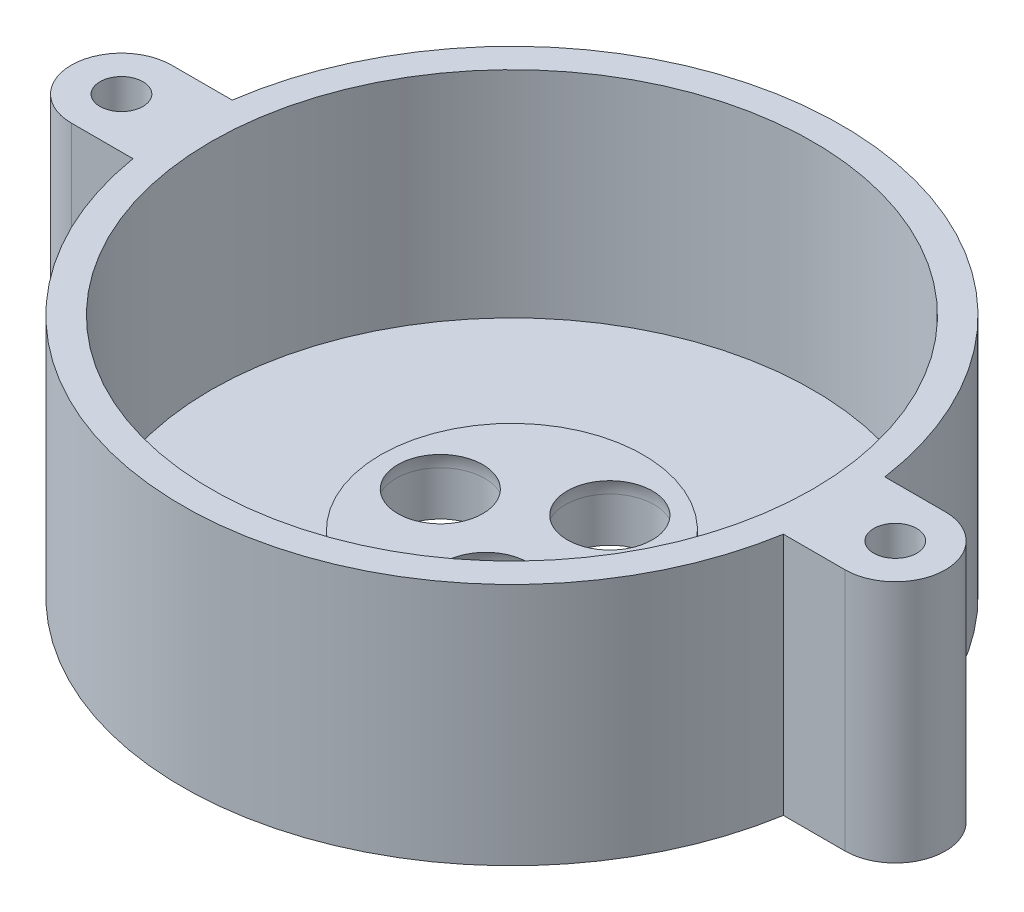
ISO-10303-21;
HEADER;
FILE_DESCRIPTION(('STEP AP214'),'2;1');
FILE_NAME('part.step','',(''),(''),'','','');
FILE_SCHEMA(('AUTOMOTIVE_DESIGN { 1 0 10303 214 1 1 1 1 }'));
ENDSEC;
DATA;
#1=APPLICATION_CONTEXT('core data for automotive mechanical design processes');
#2=APPLICATION_PROTOCOL_DEFINITION('international standard','automotive_design',2000,#1);
#3=PRODUCT_CONTEXT('',#1,'mechanical');
#4=PRODUCT('Part','Part','',(#3));
#5=PRODUCT_RELATED_PRODUCT_CATEGORY('part','',(#4));
#6=PRODUCT_DEFINITION_FORMATION('','',#4);
#7=PRODUCT_DEFINITION_CONTEXT('part definition',#1,'design');
#8=PRODUCT_DEFINITION('design','',#6,#7);
#9=PRODUCT_DEFINITION_SHAPE('','',#8);
#10=(LENGTH_UNIT() NAMED_UNIT(*) SI_UNIT(.MILLI.,.METRE.));
#11=(NAMED_UNIT(*) PLANE_ANGLE_UNIT() SI_UNIT($,.RADIAN.));
#12=(NAMED_UNIT(*) SI_UNIT($,.STERADIAN.) SOLID_ANGLE_UNIT());
#13=UNCERTAINTY_MEASURE_WITH_UNIT(LENGTH_MEASURE(1.E-05),#10,'distance_accuracy_value','');
#14=(GEOMETRIC_REPRESENTATION_CONTEXT(3) GLOBAL_UNCERTAINTY_ASSIGNED_CONTEXT((#13)) GLOBAL_UNIT_ASSIGNED_CONTEXT((#10,
#11,#12)) REPRESENTATION_CONTEXT('',''));
#15=CARTESIAN_POINT('',(0.,0.,0.));
#16=DIRECTION('',(0.,0.,1.));
#17=DIRECTION('',(1.,0.,0.));
#18=AXIS2_PLACEMENT_3D('',#15,#16,#17);
#19=CARTESIAN_POINT('',(0.,17.,0.));
#20=DIRECTION('',(0.,-1.,0.));
#21=DIRECTION('',(1.,0.,0.));
#22=AXIS2_PLACEMENT_3D('',#19,#20,#21);
#23=PLANE('',#22);
#24=CARTESIAN_POINT('',(0.,17.,0.));
#25=DIRECTION('',(0.,-1.,0.));
#26=DIRECTION('',(1.,0.,0.));
#27=AXIS2_PLACEMENT_3D('',#24,#25,#26);
#28=CIRCLE('',#27,21.);
#29=CARTESIAN_POINT('',(21.,17.,0.));
#30=VERTEX_POINT('',#29);
#31=EDGE_CURVE('E40',#30,#30,#28,.T.);
#32=ORIENTED_EDGE('',*,*,#31,.T.);
#33=EDGE_LOOP('',(#32));
#34=FACE_BOUND('',#33,.T.);
#35=CARTESIAN_POINT('',(27.,17.,0.250000000000004));
#36=DIRECTION('',(0.,-1.,0.));
#37=DIRECTION('',(1.,0.,0.));
#38=AXIS2_PLACEMENT_3D('',#35,#36,#37);
#39=CIRCLE('',#38,1.5);
#40=CARTESIAN_POINT('',(28.5,17.,0.250000000000004));
#41=VERTEX_POINT('',#40);
#42=EDGE_CURVE('E166',#41,#41,#39,.F.);
#43=ORIENTED_EDGE('',*,*,#42,.F.);
#44=EDGE_LOOP('',(#43));
#45=FACE_BOUND('',#44,.T.);
#46=DIRECTION('',(-1.,0.,0.));
#47=VECTOR('',#46,1.);
#48=CARTESIAN_POINT('',(-27.,17.,-3.25));
#49=LINE('',#48,#47);
#50=CARTESIAN_POINT('',(-22.7692226481274,17.,-3.24999999999999));
#51=VERTEX_POINT('',#50);
#52=CARTESIAN_POINT('',(-27.,17.,-3.25));
#53=VERTEX_POINT('',#52);
#54=EDGE_CURVE('E184',#51,#53,#49,.T.);
#55=ORIENTED_EDGE('',*,*,#54,.T.);
#56=CARTESIAN_POINT('',(-27.,17.,0.250000000000004));
#57=DIRECTION('',(0.,-1.,0.));
#58=DIRECTION('',(1.,0.,0.));
#59=AXIS2_PLACEMENT_3D('',#56,#57,#58);
#60=CIRCLE('',#59,3.5);
#61=CARTESIAN_POINT('',(-27.,17.,3.75));
#62=VERTEX_POINT('',#61);
#63=EDGE_CURVE('E193',#53,#62,#60,.F.);
#64=ORIENTED_EDGE('',*,*,#63,.T.);
#65=DIRECTION('',(1.,0.,0.));
#66=VECTOR('',#65,1.);
#67=CARTESIAN_POINT('',(-27.,17.,3.75));
#68=LINE('',#67,#66);
#69=CARTESIAN_POINT('',(-22.6922343545099,17.,3.75));
#70=VERTEX_POINT('',#69);
#71=EDGE_CURVE('E190',#62,#70,#68,.T.);
#72=ORIENTED_EDGE('',*,*,#71,.T.);
#73=CARTESIAN_POINT('',(0.,17.,0.));
#74=DIRECTION('',(0.,-1.,0.));
#75=DIRECTION('',(1.,0.,0.));
#76=AXIS2_PLACEMENT_3D('',#73,#74,#75);
#77=CIRCLE('',#76,23.);
#78=CARTESIAN_POINT('',(22.6922343545099,17.,3.75));
#79=VERTEX_POINT('',#78);
#80=EDGE_CURVE('E185',#79,#70,#77,.T.);
#81=ORIENTED_EDGE('',*,*,#80,.F.);
#82=DIRECTION('',(1.,0.,0.));
#83=VECTOR('',#82,1.);
#84=CARTESIAN_POINT('',(27.,17.,3.75));
#85=LINE('',#84,#83);
#86=CARTESIAN_POINT('',(27.,17.,3.75));
#87=VERTEX_POINT('',#86);
#88=EDGE_CURVE('E11',#79,#87,#85,.T.);
#89=ORIENTED_EDGE('',*,*,#88,.T.);
#90=CARTESIAN_POINT('',(27.,17.,0.250000000000004));
#91=DIRECTION('',(0.,-1.,0.));
#92=DIRECTION('',(1.,0.,0.));
#93=AXIS2_PLACEMENT_3D('',#90,#91,#92);
#94=CIRCLE('',#93,3.5);
#95=CARTESIAN_POINT('',(27.,17.,-3.25));
#96=VERTEX_POINT('',#95);
#97=EDGE_CURVE('E53',#87,#96,#94,.F.);
#98=ORIENTED_EDGE('',*,*,#97,.T.);
#99=DIRECTION('',(-1.,0.,0.));
#100=VECTOR('',#99,1.);
#101=CARTESIAN_POINT('',(27.,17.,-3.25));
#102=LINE('',#101,#100);
#103=CARTESIAN_POINT('',(22.7692226481274,17.,-3.25));
#104=VERTEX_POINT('',#103);
#105=EDGE_CURVE('E45',#96,#104,#102,.T.);
#106=ORIENTED_EDGE('',*,*,#105,.T.);
#107=EDGE_CURVE('E187',#51,#104,#77,.T.);
#108=ORIENTED_EDGE('',*,*,#107,.F.);
#109=EDGE_LOOP('',(#55,#64,#72,#81,#89,#98,#106,#108));
#110=FACE_BOUND('',#109,.T.);
#111=CARTESIAN_POINT('',(-27.,17.,0.250000000000004));
#112=DIRECTION('',(0.,-1.,0.));
#113=DIRECTION('',(1.,0.,0.));
#114=AXIS2_PLACEMENT_3D('',#111,#112,#113);
#115=CIRCLE('',#114,1.5);
#116=CARTESIAN_POINT('',(-25.5,17.,0.250000000000004));
#117=VERTEX_POINT('',#116);
#118=EDGE_CURVE('E181',#117,#117,#115,.F.);
#119=ORIENTED_EDGE('',*,*,#118,.F.);
#120=EDGE_LOOP('',(#119));
#121=FACE_BOUND('',#120,.T.);
#122=ADVANCED_FACE('F37',(#34,#45,#110,#121),#23,.F.);
#123=CARTESIAN_POINT('',(0.,4.,0.));
#124=DIRECTION('',(0.,-1.,0.));
#125=DIRECTION('',(1.,0.,0.));
#126=AXIS2_PLACEMENT_3D('',#123,#124,#125);
#127=PLANE('',#126);
#128=CARTESIAN_POINT('',(2.49999999999996,4.,4.33012701892222));
#129=DIRECTION('',(0.,-1.,0.));
#130=DIRECTION('',(1.,0.,0.));
#131=AXIS2_PLACEMENT_3D('',#128,#129,#130);
#132=CIRCLE('',#131,2.96647939483827);
#133=CARTESIAN_POINT('',(5.46647939483823,4.,4.33012701892222));
#134=VERTEX_POINT('',#133);
#135=EDGE_CURVE('E175',#134,#134,#132,.F.);
#136=ORIENTED_EDGE('',*,*,#135,.F.);
#137=EDGE_LOOP('',(#136));
#138=FACE_BOUND('',#137,.T.);
#139=CARTESIAN_POINT('',(2.50000000000002,4.,-4.33012701892218));
#140=DIRECTION('',(0.,-1.,0.));
#141=DIRECTION('',(1.,0.,0.));
#142=AXIS2_PLACEMENT_3D('',#139,#140,#141);
#143=CIRCLE('',#142,2.96647939483827);
#144=CARTESIAN_POINT('',(5.46647939483829,4.,-4.33012701892218));
#145=VERTEX_POINT('',#144);
#146=EDGE_CURVE('E170',#145,#145,#143,.F.);
#147=ORIENTED_EDGE('',*,*,#146,.F.);
#148=EDGE_LOOP('',(#147));
#149=FACE_BOUND('',#148,.T.);
#150=CARTESIAN_POINT('',(-5.,4.,0.));
#151=DIRECTION('',(0.,-1.,0.));
#152=DIRECTION('',(1.,0.,0.));
#153=AXIS2_PLACEMENT_3D('',#150,#151,#152);
#154=CIRCLE('',#153,2.96647939483827);
#155=CARTESIAN_POINT('',(-2.03352060516173,4.,0.));
#156=VERTEX_POINT('',#155);
#157=EDGE_CURVE('E124',#156,#156,#154,.F.);
#158=ORIENTED_EDGE('',*,*,#157,.F.);
#159=EDGE_LOOP('',(#158));
#160=FACE_BOUND('',#159,.T.);
#161=CARTESIAN_POINT('',(0.,4.,0.));
#162=DIRECTION('',(0.,1.,0.));
#163=DIRECTION('',(-1.,0.,0.));
#164=AXIS2_PLACEMENT_3D('',#161,#162,#163);
#165=CIRCLE('',#164,9.15767728552784);
#166=CARTESIAN_POINT('',(-9.15767728552784,4.,0.));
#167=VERTEX_POINT('',#166);
#168=EDGE_CURVE('E160',#167,#167,#165,.T.);
#169=ORIENTED_EDGE('',*,*,#168,.T.);
#170=EDGE_LOOP('',(#169));
#171=FACE_BOUND('',#170,.T.);
#172=ADVANCED_FACE('F223',(#138,#149,#160,#171),#127,.F.);
#173=CARTESIAN_POINT('',(0.,25.4499443206436,0.));
#174=DIRECTION('',(0.,1.,0.));
#175=DIRECTION('',(-1.,0.,0.));
#176=AXIS2_PLACEMENT_3D('',#173,#174,#175);
#177=CYLINDRICAL_SURFACE('',#176,9.15767728552784);
#178=CARTESIAN_POINT('',(0.,2.,0.));
#179=DIRECTION('',(0.,1.,0.));
#180=DIRECTION('',(-1.,0.,0.));
#181=AXIS2_PLACEMENT_3D('',#178,#179,#180);
#182=CIRCLE('',#181,9.15767728552784);
#183=CARTESIAN_POINT('',(-9.15767728552784,2.,0.));
#184=VERTEX_POINT('',#183);
#185=EDGE_CURVE('E157',#184,#184,#182,.T.);
#186=ORIENTED_EDGE('',*,*,#185,.T.);
#187=EDGE_LOOP('',(#186));
#188=FACE_BOUND('',#187,.T.);
#189=ORIENTED_EDGE('',*,*,#168,.F.);
#190=EDGE_LOOP('',(#189));
#191=FACE_BOUND('',#190,.T.);
#192=ADVANCED_FACE('F229',(#188,#191),#177,.T.);
#193=CARTESIAN_POINT('',(0.,2.,0.));
#194=DIRECTION('',(0.,1.,0.));
#195=DIRECTION('',(-1.,0.,0.));
#196=AXIS2_PLACEMENT_3D('',#193,#194,#195);
#197=PLANE('',#196);
#198=CARTESIAN_POINT('',(0.,2.,0.));
#199=DIRECTION('',(0.,1.,0.));
#200=DIRECTION('',(-1.,0.,0.));
#201=AXIS2_PLACEMENT_3D('',#198,#199,#200);
#202=CIRCLE('',#201,21.);
#203=CARTESIAN_POINT('',(-21.,2.,0.));
#204=VERTEX_POINT('',#203);
#205=EDGE_CURVE('E149',#204,#204,#202,.T.);
#206=ORIENTED_EDGE('',*,*,#205,.T.);
#207=EDGE_LOOP('',(#206));
#208=FACE_BOUND('',#207,.T.);
#209=ORIENTED_EDGE('',*,*,#185,.F.);
#210=EDGE_LOOP('',(#209));
#211=FACE_BOUND('',#210,.T.);
#212=ADVANCED_FACE('F253',(#208,#211),#197,.T.);
#213=CARTESIAN_POINT('',(0.,25.4499443206436,0.));
#214=DIRECTION('',(0.,1.,0.));
#215=DIRECTION('',(-1.,0.,0.));
#216=AXIS2_PLACEMENT_3D('',#213,#214,#215);
#217=CYLINDRICAL_SURFACE('',#216,21.);
#218=ORIENTED_EDGE('',*,*,#31,.F.);
#219=EDGE_LOOP('',(#218));
#220=FACE_BOUND('',#219,.T.);
#221=ORIENTED_EDGE('',*,*,#205,.F.);
#222=EDGE_LOOP('',(#221));
#223=FACE_BOUND('',#222,.T.);
#224=ADVANCED_FACE('F249',(#220,#223),#217,.F.);
#225=CARTESIAN_POINT('',(-5.,3.1,0.));
#226=DIRECTION('',(0.,1.,0.));
#227=DIRECTION('',(-1.,0.,0.));
#228=AXIS2_PLACEMENT_3D('',#225,#226,#227);
#229=SPHERICAL_SURFACE('',#228,3.1);
#230=CARTESIAN_POINT('',(-5.,3.1,0.));
#231=DIRECTION('',(0.,1.,0.));
#232=DIRECTION('',(0.,0.,1.));
#233=AXIS2_PLACEMENT_3D('',#230,#231,#232);
#234=CIRCLE('',#233,3.1);
#235=CARTESIAN_POINT('',(-5.,3.1,3.1));
#236=VERTEX_POINT('',#235);
#237=EDGE_CURVE('E173',#236,#236,#234,.T.);
#238=ORIENTED_EDGE('',*,*,#237,.F.);
#239=EDGE_LOOP('',(#238));
#240=FACE_BOUND('',#239,.T.);
#241=ORIENTED_EDGE('',*,*,#157,.T.);
#242=EDGE_LOOP('',(#241));
#243=FACE_BOUND('',#242,.T.);
#244=ADVANCED_FACE('F252',(#240,#243),#229,.F.);
#245=CARTESIAN_POINT('',(2.50000000000002,3.1,-4.33012701892218));
#246=DIRECTION('',(0.,1.,0.));
#247=DIRECTION('',(0.500000000000004,0.,-0.866025403784436));
#248=AXIS2_PLACEMENT_3D('',#245,#246,#247);
#249=SPHERICAL_SURFACE('',#248,3.1);
#250=CARTESIAN_POINT('',(2.50000000000002,3.1,-4.33012701892218));
#251=DIRECTION('',(0.,1.,0.));
#252=DIRECTION('',(-0.866025403784436,0.,-0.500000000000004));
#253=AXIS2_PLACEMENT_3D('',#250,#251,#252);
#254=CIRCLE('',#253,3.1);
#255=CARTESIAN_POINT('',(-0.184678751731733,3.1,-5.8801270189222));
#256=VERTEX_POINT('',#255);
#257=EDGE_CURVE('E178',#256,#256,#254,.T.);
#258=ORIENTED_EDGE('',*,*,#257,.F.);
#259=EDGE_LOOP('',(#258));
#260=FACE_BOUND('',#259,.T.);
#261=ORIENTED_EDGE('',*,*,#146,.T.);
#262=EDGE_LOOP('',(#261));
#263=FACE_BOUND('',#262,.T.);
#264=ADVANCED_FACE('F286',(#260,#263),#249,.F.);
#265=CARTESIAN_POINT('',(2.49999999999996,3.1,4.33012701892222));
#266=DIRECTION('',(0.,1.,0.));
#267=DIRECTION('',(0.499999999999992,0.,0.866025403784443));
#268=AXIS2_PLACEMENT_3D('',#265,#266,#267);
#269=SPHERICAL_SURFACE('',#268,3.1);
#270=CARTESIAN_POINT('',(2.49999999999996,3.1,4.33012701892222));
#271=DIRECTION('',(0.,1.,0.));
#272=DIRECTION('',(0.866025403784443,0.,-0.499999999999992));
#273=AXIS2_PLACEMENT_3D('',#270,#271,#272);
#274=CIRCLE('',#273,3.1);
#275=CARTESIAN_POINT('',(5.18467875173173,3.1,2.78012701892224));
#276=VERTEX_POINT('',#275);
#277=EDGE_CURVE('E310',#276,#276,#274,.T.);
#278=ORIENTED_EDGE('',*,*,#277,.F.);
#279=EDGE_LOOP('',(#278));
#280=FACE_BOUND('',#279,.T.);
#281=ORIENTED_EDGE('',*,*,#135,.T.);
#282=EDGE_LOOP('',(#281));
#283=FACE_BOUND('',#282,.T.);
#284=ADVANCED_FACE('F292',(#280,#283),#269,.F.);
#285=CARTESIAN_POINT('',(-5.,6.2,0.));
#286=DIRECTION('',(0.,1.,0.));
#287=DIRECTION('',(0.,0.,1.));
#288=AXIS2_PLACEMENT_3D('',#285,#286,#287);
#289=CYLINDRICAL_SURFACE('',#288,3.1);
#290=ORIENTED_EDGE('',*,*,#237,.T.);
#291=EDGE_LOOP('',(#290));
#292=FACE_BOUND('',#291,.T.);
#293=CARTESIAN_POINT('',(-5.,0.,0.));
#294=DIRECTION('',(0.,1.,0.));
#295=DIRECTION('',(0.,0.,1.));
#296=AXIS2_PLACEMENT_3D('',#293,#294,#295);
#297=CIRCLE('',#296,3.1);
#298=CARTESIAN_POINT('',(-5.,0.,3.1));
#299=VERTEX_POINT('',#298);
#300=EDGE_CURVE('E169',#299,#299,#297,.T.);
#301=ORIENTED_EDGE('',*,*,#300,.F.);
#302=EDGE_LOOP('',(#301));
#303=FACE_BOUND('',#302,.T.);
#304=ADVANCED_FACE('F288',(#292,#303),#289,.F.);
#305=CARTESIAN_POINT('',(2.50000000000002,6.2,-4.33012701892218));
#306=DIRECTION('',(0.,1.,0.));
#307=DIRECTION('',(-0.866025403784436,0.,-0.500000000000004));
#308=AXIS2_PLACEMENT_3D('',#305,#306,#307);
#309=CYLINDRICAL_SURFACE('',#308,3.1);
#310=ORIENTED_EDGE('',*,*,#257,.T.);
#311=EDGE_LOOP('',(#310));
#312=FACE_BOUND('',#311,.T.);
#313=CARTESIAN_POINT('',(2.50000000000002,0.,-4.33012701892218));
#314=DIRECTION('',(0.,1.,0.));
#315=DIRECTION('',(-0.866025403784436,0.,-0.500000000000004));
#316=AXIS2_PLACEMENT_3D('',#313,#314,#315);
#317=CIRCLE('',#316,3.1);
#318=CARTESIAN_POINT('',(-0.184678751731733,0.,-5.8801270189222));
#319=VERTEX_POINT('',#318);
#320=EDGE_CURVE('E174',#319,#319,#317,.T.);
#321=ORIENTED_EDGE('',*,*,#320,.F.);
#322=EDGE_LOOP('',(#321));
#323=FACE_BOUND('',#322,.T.);
#324=ADVANCED_FACE('F291',(#312,#323),#309,.F.);
#325=CARTESIAN_POINT('',(2.49999999999996,6.2,4.33012701892222));
#326=DIRECTION('',(0.,1.,0.));
#327=DIRECTION('',(0.866025403784443,0.,-0.499999999999992));
#328=AXIS2_PLACEMENT_3D('',#325,#326,#327);
#329=CYLINDRICAL_SURFACE('',#328,3.1);
#330=ORIENTED_EDGE('',*,*,#277,.T.);
#331=EDGE_LOOP('',(#330));
#332=FACE_BOUND('',#331,.T.);
#333=CARTESIAN_POINT('',(2.49999999999996,0.,4.33012701892222));
#334=DIRECTION('',(0.,1.,0.));
#335=DIRECTION('',(0.866025403784443,0.,-0.499999999999992));
#336=AXIS2_PLACEMENT_3D('',#333,#334,#335);
#337=CIRCLE('',#336,3.1);
#338=CARTESIAN_POINT('',(5.18467875173173,0.,2.78012701892224));
#339=VERTEX_POINT('',#338);
#340=EDGE_CURVE('E179',#339,#339,#337,.T.);
#341=ORIENTED_EDGE('',*,*,#340,.F.);
#342=EDGE_LOOP('',(#341));
#343=FACE_BOUND('',#342,.T.);
#344=ADVANCED_FACE('F247',(#332,#343),#329,.F.);
#345=CARTESIAN_POINT('',(-27.,20.,0.250000000000004));
#346=DIRECTION('',(0.,-1.,0.));
#347=DIRECTION('',(0.,0.,-1.));
#348=AXIS2_PLACEMENT_3D('',#345,#346,#347);
#349=CYLINDRICAL_SURFACE('',#348,3.5);
#350=ORIENTED_EDGE('',*,*,#63,.F.);
#351=DIRECTION('',(0.,-1.,0.));
#352=VECTOR('',#351,1.);
#353=CARTESIAN_POINT('',(-27.,20.,-3.25));
#354=LINE('',#353,#352);
#355=CARTESIAN_POINT('',(-27.,0.,-3.25));
#356=VERTEX_POINT('',#355);
#357=EDGE_CURVE('E146',#53,#356,#354,.T.);
#358=ORIENTED_EDGE('',*,*,#357,.T.);
#359=CARTESIAN_POINT('',(-27.,0.,0.250000000000004));
#360=DIRECTION('',(0.,-1.,0.));
#361=DIRECTION('',(0.,0.,-1.));
#362=AXIS2_PLACEMENT_3D('',#359,#360,#361);
#363=CIRCLE('',#362,3.5);
#364=CARTESIAN_POINT('',(-27.,0.,3.75));
#365=VERTEX_POINT('',#364);
#366=EDGE_CURVE('E137',#365,#356,#363,.T.);
#367=ORIENTED_EDGE('',*,*,#366,.F.);
#368=DIRECTION('',(0.,-1.,0.));
#369=VECTOR('',#368,1.);
#370=CARTESIAN_POINT('',(-27.,20.,3.75));
#371=LINE('',#370,#369);
#372=EDGE_CURVE('E147',#62,#365,#371,.T.);
#373=ORIENTED_EDGE('',*,*,#372,.F.);
#374=EDGE_LOOP('',(#350,#358,#367,#373));
#375=FACE_BOUND('',#374,.T.);
#376=ADVANCED_FACE('F244',(#375),#349,.T.);
#377=CARTESIAN_POINT('',(0.,25.4499443206436,0.));
#378=DIRECTION('',(0.,1.,0.));
#379=DIRECTION('',(-1.,0.,0.));
#380=AXIS2_PLACEMENT_3D('',#377,#378,#379);
#381=CYLINDRICAL_SURFACE('',#380,23.);
#382=DIRECTION('',(0.,-1.,0.));
#383=VECTOR('',#382,1.);
#384=CARTESIAN_POINT('',(-22.7692226481274,20.,-3.24999999999999));
#385=LINE('',#384,#383);
#386=CARTESIAN_POINT('',(-22.7692226481274,0.,-3.25));
#387=VERTEX_POINT('',#386);
#388=EDGE_CURVE('E152',#51,#387,#385,.T.);
#389=ORIENTED_EDGE('',*,*,#388,.F.);
#390=ORIENTED_EDGE('',*,*,#107,.T.);
#391=DIRECTION('',(0.,-1.,0.));
#392=VECTOR('',#391,1.);
#393=CARTESIAN_POINT('',(22.7692226481274,20.,-3.25));
#394=LINE('',#393,#392);
#395=CARTESIAN_POINT('',(22.7692226481274,0.,-3.25));
#396=VERTEX_POINT('',#395);
#397=EDGE_CURVE('E132',#104,#396,#394,.T.);
#398=ORIENTED_EDGE('',*,*,#397,.T.);
#399=CARTESIAN_POINT('',(0.,0.,0.));
#400=DIRECTION('',(0.,1.,0.));
#401=DIRECTION('',(-1.,0.,0.));
#402=AXIS2_PLACEMENT_3D('',#399,#400,#401);
#403=CIRCLE('',#402,23.);
#404=EDGE_CURVE('E163',#396,#387,#403,.T.);
#405=ORIENTED_EDGE('',*,*,#404,.T.);
#406=EDGE_LOOP('',(#389,#390,#398,#405));
#407=FACE_BOUND('',#406,.T.);
#408=ADVANCED_FACE('F202',(#407),#381,.T.);
#409=CARTESIAN_POINT('',(27.,20.,0.250000000000004));
#410=DIRECTION('',(0.,-1.,0.));
#411=DIRECTION('',(0.,0.,-1.));
#412=AXIS2_PLACEMENT_3D('',#409,#410,#411);
#413=CYLINDRICAL_SURFACE('',#412,3.5);
#414=ORIENTED_EDGE('',*,*,#97,.F.);
#415=DIRECTION('',(0.,-1.,0.));
#416=VECTOR('',#415,1.);
#417=CARTESIAN_POINT('',(27.,20.,3.75));
#418=LINE('',#417,#416);
#419=CARTESIAN_POINT('',(27.,0.,3.75));
#420=VERTEX_POINT('',#419);
#421=EDGE_CURVE('E100',#87,#420,#418,.T.);
#422=ORIENTED_EDGE('',*,*,#421,.T.);
#423=CARTESIAN_POINT('',(27.,0.,0.250000000000004));
#424=DIRECTION('',(0.,-1.,0.));
#425=DIRECTION('',(0.,0.,1.));
#426=AXIS2_PLACEMENT_3D('',#423,#424,#425);
#427=CIRCLE('',#426,3.5);
#428=CARTESIAN_POINT('',(27.,0.,-3.25));
#429=VERTEX_POINT('',#428);
#430=EDGE_CURVE('E104',#429,#420,#427,.T.);
#431=ORIENTED_EDGE('',*,*,#430,.F.);
#432=DIRECTION('',(0.,-1.,0.));
#433=VECTOR('',#432,1.);
#434=CARTESIAN_POINT('',(27.,20.,-3.25));
#435=LINE('',#434,#433);
#436=EDGE_CURVE('E129',#96,#429,#435,.T.);
#437=ORIENTED_EDGE('',*,*,#436,.F.);
#438=EDGE_LOOP('',(#414,#422,#431,#437));
#439=FACE_BOUND('',#438,.T.);
#440=ADVANCED_FACE('F102',(#439),#413,.T.);
#441=CARTESIAN_POINT('',(0.,0.,0.));
#442=DIRECTION('',(0.,1.,0.));
#443=DIRECTION('',(-1.,0.,0.));
#444=AXIS2_PLACEMENT_3D('',#441,#442,#443);
#445=PLANE('',#444);
#446=ORIENTED_EDGE('',*,*,#340,.T.);
#447=EDGE_LOOP('',(#446));
#448=FACE_BOUND('',#447,.T.);
#449=ORIENTED_EDGE('',*,*,#320,.T.);
#450=EDGE_LOOP('',(#449));
#451=FACE_BOUND('',#450,.T.);
#452=ORIENTED_EDGE('',*,*,#300,.T.);
#453=EDGE_LOOP('',(#452));
#454=FACE_BOUND('',#453,.T.);
#455=CARTESIAN_POINT('',(-22.6922343545099,0.,3.75));
#456=VERTEX_POINT('',#455);
#457=CARTESIAN_POINT('',(22.6922343545099,0.,3.75));
#458=VERTEX_POINT('',#457);
#459=EDGE_CURVE('E164',#456,#458,#403,.T.);
#460=ORIENTED_EDGE('',*,*,#459,.F.);
#461=DIRECTION('',(-1.,0.,0.));
#462=VECTOR('',#461,1.);
#463=CARTESIAN_POINT('',(-27.,0.,3.75));
#464=LINE('',#463,#462);
#465=EDGE_CURVE('E143',#456,#365,#464,.T.);
#466=ORIENTED_EDGE('',*,*,#465,.T.);
#467=ORIENTED_EDGE('',*,*,#366,.T.);
#468=DIRECTION('',(1.,0.,0.));
#469=VECTOR('',#468,1.);
#470=CARTESIAN_POINT('',(-27.,0.,-3.25));
#471=LINE('',#470,#469);
#472=EDGE_CURVE('E140',#356,#387,#471,.T.);
#473=ORIENTED_EDGE('',*,*,#472,.T.);
#474=ORIENTED_EDGE('',*,*,#404,.F.);
#475=DIRECTION('',(1.,0.,0.));
#476=VECTOR('',#475,1.);
#477=CARTESIAN_POINT('',(27.,0.,-3.25));
#478=LINE('',#477,#476);
#479=EDGE_CURVE('E107',#396,#429,#478,.T.);
#480=ORIENTED_EDGE('',*,*,#479,.T.);
#481=ORIENTED_EDGE('',*,*,#430,.T.);
#482=DIRECTION('',(-1.,0.,0.));
#483=VECTOR('',#482,1.);
#484=CARTESIAN_POINT('',(27.,0.,3.75));
#485=LINE('',#484,#483);
#486=EDGE_CURVE('E110',#420,#458,#485,.T.);
#487=ORIENTED_EDGE('',*,*,#486,.T.);
#488=EDGE_LOOP('',(#460,#466,#467,#473,#474,#480,#481,#487));
#489=FACE_BOUND('',#488,.T.);
#490=CARTESIAN_POINT('',(-27.,0.,0.250000000000004));
#491=DIRECTION('',(0.,-1.,0.));
#492=DIRECTION('',(0.,0.,-1.));
#493=AXIS2_PLACEMENT_3D('',#490,#491,#492);
#494=CIRCLE('',#493,1.5);
#495=CARTESIAN_POINT('',(-27.,0.,-1.25));
#496=VERTEX_POINT('',#495);
#497=EDGE_CURVE('E131',#496,#496,#494,.T.);
#498=ORIENTED_EDGE('',*,*,#497,.F.);
#499=EDGE_LOOP('',(#498));
#500=FACE_BOUND('',#499,.T.);
#501=CARTESIAN_POINT('',(27.,0.,0.250000000000004));
#502=DIRECTION('',(0.,-1.,0.));
#503=DIRECTION('',(0.,0.,1.));
#504=AXIS2_PLACEMENT_3D('',#501,#502,#503);
#505=CIRCLE('',#504,1.5);
#506=CARTESIAN_POINT('',(27.,0.,1.75));
#507=VERTEX_POINT('',#506);
#508=EDGE_CURVE('E121',#507,#507,#505,.T.);
#509=ORIENTED_EDGE('',*,*,#508,.F.);
#510=EDGE_LOOP('',(#509));
#511=FACE_BOUND('',#510,.T.);
#512=ADVANCED_FACE('F117',(#448,#451,#454,#489,#500,#511),#445,.F.);
#513=CARTESIAN_POINT('',(27.,20.,0.250000000000004));
#514=DIRECTION('',(0.,-1.,0.));
#515=DIRECTION('',(0.,0.,-1.));
#516=AXIS2_PLACEMENT_3D('',#513,#514,#515);
#517=CYLINDRICAL_SURFACE('',#516,1.5);
#518=ORIENTED_EDGE('',*,*,#42,.T.);
#519=EDGE_LOOP('',(#518));
#520=FACE_BOUND('',#519,.T.);
#521=ORIENTED_EDGE('',*,*,#508,.T.);
#522=EDGE_LOOP('',(#521));
#523=FACE_BOUND('',#522,.T.);
#524=ADVANCED_FACE('F262',(#520,#523),#517,.F.);
#525=DIRECTION('',(0.,-1.,0.));
#526=VECTOR('',#525,1.);
#527=CARTESIAN_POINT('',(22.6922343545099,20.,3.75));
#528=LINE('',#527,#526);
#529=EDGE_CURVE('E106',#79,#458,#528,.T.);
#530=ORIENTED_EDGE('',*,*,#529,.F.);
#531=ORIENTED_EDGE('',*,*,#80,.T.);
#532=DIRECTION('',(0.,-1.,0.));
#533=VECTOR('',#532,1.);
#534=CARTESIAN_POINT('',(-22.6922343545099,20.,3.75));
#535=LINE('',#534,#533);
#536=EDGE_CURVE('E150',#70,#456,#535,.T.);
#537=ORIENTED_EDGE('',*,*,#536,.T.);
#538=ORIENTED_EDGE('',*,*,#459,.T.);
#539=EDGE_LOOP('',(#530,#531,#537,#538));
#540=FACE_BOUND('',#539,.T.);
#541=ADVANCED_FACE('F219',(#540),#381,.T.);
#542=CARTESIAN_POINT('',(27.,20.,3.75));
#543=DIRECTION('',(0.,0.,1.));
#544=DIRECTION('',(1.,0.,0.));
#545=AXIS2_PLACEMENT_3D('',#542,#543,#544);
#546=PLANE('',#545);
#547=ORIENTED_EDGE('',*,*,#88,.F.);
#548=ORIENTED_EDGE('',*,*,#529,.T.);
#549=ORIENTED_EDGE('',*,*,#486,.F.);
#550=ORIENTED_EDGE('',*,*,#421,.F.);
#551=EDGE_LOOP('',(#547,#548,#549,#550));
#552=FACE_BOUND('',#551,.T.);
#553=ADVANCED_FACE('F111',(#552),#546,.T.);
#554=CARTESIAN_POINT('',(27.,20.,-3.25));
#555=DIRECTION('',(0.,0.,-1.));
#556=DIRECTION('',(-1.,0.,0.));
#557=AXIS2_PLACEMENT_3D('',#554,#555,#556);
#558=PLANE('',#557);
#559=ORIENTED_EDGE('',*,*,#105,.F.);
#560=ORIENTED_EDGE('',*,*,#436,.T.);
#561=ORIENTED_EDGE('',*,*,#479,.F.);
#562=ORIENTED_EDGE('',*,*,#397,.F.);
#563=EDGE_LOOP('',(#559,#560,#561,#562));
#564=FACE_BOUND('',#563,.T.);
#565=ADVANCED_FACE('F209',(#564),#558,.T.);
#566=CARTESIAN_POINT('',(-27.,20.,0.250000000000004));
#567=DIRECTION('',(0.,-1.,0.));
#568=DIRECTION('',(0.,0.,-1.));
#569=AXIS2_PLACEMENT_3D('',#566,#567,#568);
#570=CYLINDRICAL_SURFACE('',#569,1.5);
#571=ORIENTED_EDGE('',*,*,#118,.T.);
#572=EDGE_LOOP('',(#571));
#573=FACE_BOUND('',#572,.T.);
#574=ORIENTED_EDGE('',*,*,#497,.T.);
#575=EDGE_LOOP('',(#574));
#576=FACE_BOUND('',#575,.T.);
#577=ADVANCED_FACE('F211',(#573,#576),#570,.F.);
#578=CARTESIAN_POINT('',(-27.,20.,-3.25));
#579=DIRECTION('',(0.,0.,-1.));
#580=DIRECTION('',(-1.,0.,0.));
#581=AXIS2_PLACEMENT_3D('',#578,#579,#580);
#582=PLANE('',#581);
#583=ORIENTED_EDGE('',*,*,#54,.F.);
#584=ORIENTED_EDGE('',*,*,#388,.T.);
#585=ORIENTED_EDGE('',*,*,#472,.F.);
#586=ORIENTED_EDGE('',*,*,#357,.F.);
#587=EDGE_LOOP('',(#583,#584,#585,#586));
#588=FACE_BOUND('',#587,.T.);
#589=ADVANCED_FACE('F217',(#588),#582,.T.);
#590=CARTESIAN_POINT('',(-27.,20.,3.75));
#591=DIRECTION('',(0.,0.,1.));
#592=DIRECTION('',(1.,0.,0.));
#593=AXIS2_PLACEMENT_3D('',#590,#591,#592);
#594=PLANE('',#593);
#595=ORIENTED_EDGE('',*,*,#71,.F.);
#596=ORIENTED_EDGE('',*,*,#372,.T.);
#597=ORIENTED_EDGE('',*,*,#465,.F.);
#598=ORIENTED_EDGE('',*,*,#536,.F.);
#599=EDGE_LOOP('',(#595,#596,#597,#598));
#600=FACE_BOUND('',#599,.T.);
#601=ADVANCED_FACE('F225',(#600),#594,.T.);
#602=CLOSED_SHELL('',(#122,#172,#192,#212,#224,#244,#264,#284,#304,#324,#344,#376,#408,#440,
#512,#524,#541,#553,#565,#577,#589,#601));
#603=MANIFOLD_SOLID_BREP('B2',#602);
#604=ADVANCED_BREP_SHAPE_REPRESENTATION('',(#18,#603),#14);
#605=SHAPE_DEFINITION_REPRESENTATION(#9,#604);
ENDSEC;
END-ISO-10303-21;
